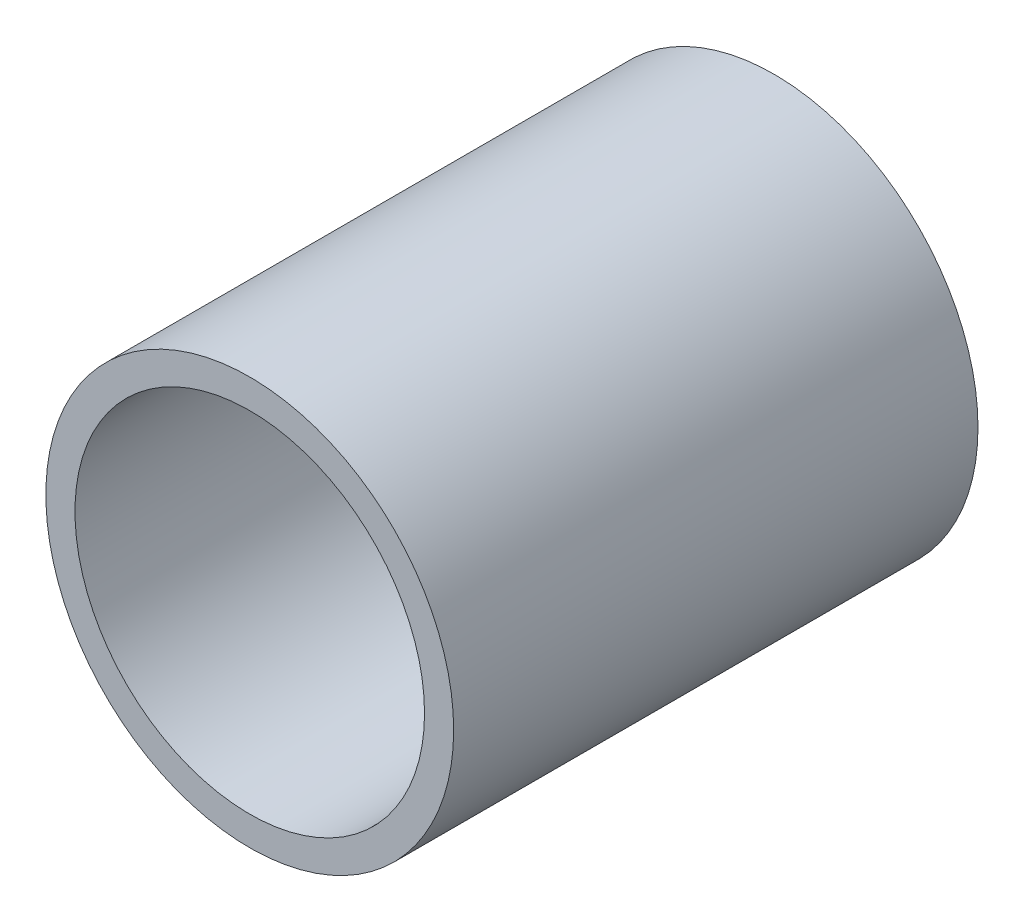
ISO-10303-21;
HEADER;
FILE_DESCRIPTION(('STEP AP214'),'2;1');
FILE_NAME('part.step','',(''),(''),'','','');
FILE_SCHEMA(('AUTOMOTIVE_DESIGN { 1 0 10303 214 1 1 1 1 }'));
ENDSEC;
DATA;
#1=APPLICATION_CONTEXT('core data for automotive mechanical design processes');
#2=APPLICATION_PROTOCOL_DEFINITION('international standard','automotive_design',2000,#1);
#3=PRODUCT_CONTEXT('',#1,'mechanical');
#4=PRODUCT('Part','Part','',(#3));
#5=PRODUCT_RELATED_PRODUCT_CATEGORY('part','',(#4));
#6=PRODUCT_DEFINITION_FORMATION('','',#4);
#7=PRODUCT_DEFINITION_CONTEXT('part definition',#1,'design');
#8=PRODUCT_DEFINITION('design','',#6,#7);
#9=PRODUCT_DEFINITION_SHAPE('','',#8);
#10=(LENGTH_UNIT() NAMED_UNIT(*) SI_UNIT(.MILLI.,.METRE.));
#11=(NAMED_UNIT(*) PLANE_ANGLE_UNIT() SI_UNIT($,.RADIAN.));
#12=(NAMED_UNIT(*) SI_UNIT($,.STERADIAN.) SOLID_ANGLE_UNIT());
#13=UNCERTAINTY_MEASURE_WITH_UNIT(LENGTH_MEASURE(1.E-05),#10,'distance_accuracy_value','');
#14=(GEOMETRIC_REPRESENTATION_CONTEXT(3) GLOBAL_UNCERTAINTY_ASSIGNED_CONTEXT((#13)) GLOBAL_UNIT_ASSIGNED_CONTEXT((#10,
#11,#12)) REPRESENTATION_CONTEXT('',''));
#15=CARTESIAN_POINT('',(0.,0.,0.));
#16=DIRECTION('',(0.,0.,1.));
#17=DIRECTION('',(1.,0.,0.));
#18=AXIS2_PLACEMENT_3D('',#15,#16,#17);
#19=CARTESIAN_POINT('',(0.,0.,114.3));
#20=DIRECTION('',(0.,0.,1.));
#21=DIRECTION('',(1.,0.,0.));
#22=AXIS2_PLACEMENT_3D('',#19,#20,#21);
#23=PLANE('',#22);
#24=CARTESIAN_POINT('',(0.,0.,114.3));
#25=DIRECTION('',(0.,0.,1.));
#26=DIRECTION('',(1.,0.,0.));
#27=AXIS2_PLACEMENT_3D('',#24,#25,#26);
#28=CIRCLE('',#27,44.45);
#29=CARTESIAN_POINT('',(44.45,0.,114.3));
#30=VERTEX_POINT('',#29);
#31=EDGE_CURVE('E11',#30,#30,#28,.T.);
#32=ORIENTED_EDGE('',*,*,#31,.T.);
#33=EDGE_LOOP('',(#32));
#34=FACE_BOUND('',#33,.T.);
#35=CARTESIAN_POINT('',(0.,0.,114.3));
#36=DIRECTION('',(0.,0.,1.));
#37=DIRECTION('',(1.,0.,0.));
#38=AXIS2_PLACEMENT_3D('',#35,#36,#37);
#39=CIRCLE('',#38,38.1);
#40=CARTESIAN_POINT('',(38.1,0.,114.3));
#41=VERTEX_POINT('',#40);
#42=EDGE_CURVE('E43',#41,#41,#39,.T.);
#43=ORIENTED_EDGE('',*,*,#42,.F.);
#44=EDGE_LOOP('',(#43));
#45=FACE_BOUND('',#44,.T.);
#46=ADVANCED_FACE('F32',(#34,#45),#23,.T.);
#47=CARTESIAN_POINT('',(0.,0.,0.));
#48=DIRECTION('',(0.,0.,1.));
#49=DIRECTION('',(1.,0.,0.));
#50=AXIS2_PLACEMENT_3D('',#47,#48,#49);
#51=PLANE('',#50);
#52=CARTESIAN_POINT('',(0.,0.,0.));
#53=DIRECTION('',(0.,0.,1.));
#54=DIRECTION('',(1.,0.,0.));
#55=AXIS2_PLACEMENT_3D('',#52,#53,#54);
#56=CIRCLE('',#55,44.45);
#57=CARTESIAN_POINT('',(44.45,0.,0.));
#58=VERTEX_POINT('',#57);
#59=EDGE_CURVE('E36',#58,#58,#56,.T.);
#60=ORIENTED_EDGE('',*,*,#59,.F.);
#61=EDGE_LOOP('',(#60));
#62=FACE_BOUND('',#61,.T.);
#63=CARTESIAN_POINT('',(0.,0.,0.));
#64=DIRECTION('',(0.,0.,1.));
#65=DIRECTION('',(1.,0.,0.));
#66=AXIS2_PLACEMENT_3D('',#63,#64,#65);
#67=CIRCLE('',#66,38.1);
#68=CARTESIAN_POINT('',(38.1,0.,0.));
#69=VERTEX_POINT('',#68);
#70=EDGE_CURVE('E45',#69,#69,#67,.T.);
#71=ORIENTED_EDGE('',*,*,#70,.T.);
#72=EDGE_LOOP('',(#71));
#73=FACE_BOUND('',#72,.T.);
#74=ADVANCED_FACE('F55',(#62,#73),#51,.F.);
#75=CARTESIAN_POINT('',(0.,0.,114.3));
#76=DIRECTION('',(0.,0.,-1.));
#77=DIRECTION('',(-1.,0.,0.));
#78=AXIS2_PLACEMENT_3D('',#75,#76,#77);
#79=CYLINDRICAL_SURFACE('',#78,44.45);
#80=ORIENTED_EDGE('',*,*,#31,.F.);
#81=EDGE_LOOP('',(#80));
#82=FACE_BOUND('',#81,.T.);
#83=ORIENTED_EDGE('',*,*,#59,.T.);
#84=EDGE_LOOP('',(#83));
#85=FACE_BOUND('',#84,.T.);
#86=ADVANCED_FACE('F34',(#82,#85),#79,.T.);
#87=CARTESIAN_POINT('',(0.,0.,114.3));
#88=DIRECTION('',(0.,0.,-1.));
#89=DIRECTION('',(-1.,0.,0.));
#90=AXIS2_PLACEMENT_3D('',#87,#88,#89);
#91=CYLINDRICAL_SURFACE('',#90,38.1);
#92=ORIENTED_EDGE('',*,*,#42,.T.);
#93=EDGE_LOOP('',(#92));
#94=FACE_BOUND('',#93,.T.);
#95=ORIENTED_EDGE('',*,*,#70,.F.);
#96=EDGE_LOOP('',(#95));
#97=FACE_BOUND('',#96,.T.);
#98=ADVANCED_FACE('F51',(#94,#97),#91,.F.);
#99=CLOSED_SHELL('',(#46,#74,#86,#98));
#100=MANIFOLD_SOLID_BREP('B2',#99);
#101=ADVANCED_BREP_SHAPE_REPRESENTATION('',(#18,#100),#14);
#102=SHAPE_DEFINITION_REPRESENTATION(#9,#101);
ENDSEC;
END-ISO-10303-21;
